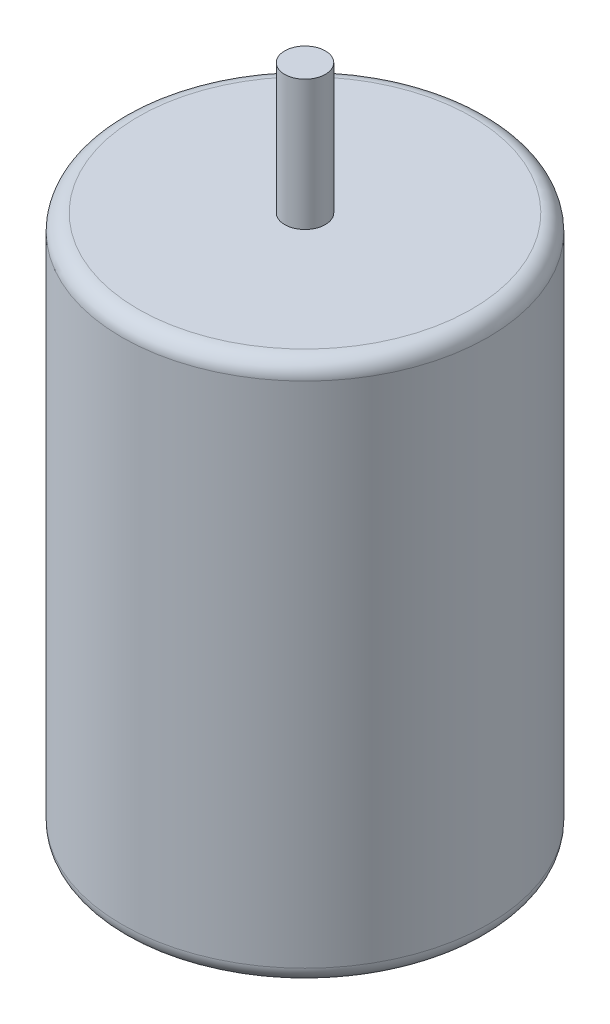
ISO-10303-21;
HEADER;
FILE_DESCRIPTION(('STEP AP214'),'2;1');
FILE_NAME('part.step','',(''),(''),'','','');
FILE_SCHEMA(('AUTOMOTIVE_DESIGN { 1 0 10303 214 1 1 1 1 }'));
ENDSEC;
DATA;
#1=APPLICATION_CONTEXT('core data for automotive mechanical design processes');
#2=APPLICATION_PROTOCOL_DEFINITION('international standard','automotive_design',2000,#1);
#3=PRODUCT_CONTEXT('',#1,'mechanical');
#4=PRODUCT('Part','Part','',(#3));
#5=PRODUCT_RELATED_PRODUCT_CATEGORY('part','',(#4));
#6=PRODUCT_DEFINITION_FORMATION('','',#4);
#7=PRODUCT_DEFINITION_CONTEXT('part definition',#1,'design');
#8=PRODUCT_DEFINITION('design','',#6,#7);
#9=PRODUCT_DEFINITION_SHAPE('','',#8);
#10=(LENGTH_UNIT() NAMED_UNIT(*) SI_UNIT(.MILLI.,.METRE.));
#11=(NAMED_UNIT(*) PLANE_ANGLE_UNIT() SI_UNIT($,.RADIAN.));
#12=(NAMED_UNIT(*) SI_UNIT($,.STERADIAN.) SOLID_ANGLE_UNIT());
#13=UNCERTAINTY_MEASURE_WITH_UNIT(LENGTH_MEASURE(1.E-05),#10,'distance_accuracy_value','');
#14=(GEOMETRIC_REPRESENTATION_CONTEXT(3) GLOBAL_UNCERTAINTY_ASSIGNED_CONTEXT((#13)) GLOBAL_UNIT_ASSIGNED_CONTEXT((#10,
#11,#12)) REPRESENTATION_CONTEXT('',''));
#15=CARTESIAN_POINT('',(0.,0.,0.));
#16=DIRECTION('',(0.,0.,1.));
#17=DIRECTION('',(1.,0.,0.));
#18=AXIS2_PLACEMENT_3D('',#15,#16,#17);
#19=CARTESIAN_POINT('',(0.,66.5,0.));
#20=DIRECTION('',(0.,-1.,0.));
#21=DIRECTION('',(0.,0.,-1.));
#22=AXIS2_PLACEMENT_3D('',#19,#20,#21);
#23=CYLINDRICAL_SURFACE('',#22,22.5);
#24=CARTESIAN_POINT('',(0.,2.,0.));
#25=DIRECTION('',(0.,1.,0.));
#26=DIRECTION('',(0.,0.,1.));
#27=AXIS2_PLACEMENT_3D('',#24,#25,#26);
#28=CIRCLE('',#27,22.5);
#29=CARTESIAN_POINT('',(0.,2.,22.5));
#30=VERTEX_POINT('',#29);
#31=EDGE_CURVE('E43',#30,#30,#28,.T.);
#32=ORIENTED_EDGE('',*,*,#31,.T.);
#33=EDGE_LOOP('',(#32));
#34=FACE_BOUND('',#33,.T.);
#35=CARTESIAN_POINT('',(0.,64.5,0.));
#36=DIRECTION('',(0.,1.,0.));
#37=DIRECTION('',(0.,0.,1.));
#38=AXIS2_PLACEMENT_3D('',#35,#36,#37);
#39=CIRCLE('',#38,22.5);
#40=CARTESIAN_POINT('',(0.,64.5,22.5));
#41=VERTEX_POINT('',#40);
#42=EDGE_CURVE('E47',#41,#41,#39,.F.);
#43=ORIENTED_EDGE('',*,*,#42,.T.);
#44=EDGE_LOOP('',(#43));
#45=FACE_BOUND('',#44,.T.);
#46=ADVANCED_FACE('F32',(#34,#45),#23,.T.);
#47=CARTESIAN_POINT('',(0.,66.5,0.));
#48=DIRECTION('',(0.,1.,0.));
#49=DIRECTION('',(0.,0.,1.));
#50=AXIS2_PLACEMENT_3D('',#47,#48,#49);
#51=PLANE('',#50);
#52=CARTESIAN_POINT('',(0.,66.5,0.));
#53=DIRECTION('',(0.,1.,0.));
#54=DIRECTION('',(0.,0.,1.));
#55=AXIS2_PLACEMENT_3D('',#52,#53,#54);
#56=CIRCLE('',#55,20.5);
#57=CARTESIAN_POINT('',(0.,66.5,20.5));
#58=VERTEX_POINT('',#57);
#59=EDGE_CURVE('E10',#58,#58,#56,.T.);
#60=ORIENTED_EDGE('',*,*,#59,.T.);
#61=EDGE_LOOP('',(#60));
#62=FACE_BOUND('',#61,.T.);
#63=CARTESIAN_POINT('',(0.,66.5,0.));
#64=DIRECTION('',(0.,1.,0.));
#65=DIRECTION('',(0.,0.,1.));
#66=AXIS2_PLACEMENT_3D('',#63,#64,#65);
#67=CIRCLE('',#66,2.5);
#68=CARTESIAN_POINT('',(0.,66.5,2.5));
#69=VERTEX_POINT('',#68);
#70=EDGE_CURVE('E53',#69,#69,#67,.T.);
#71=ORIENTED_EDGE('',*,*,#70,.F.);
#72=EDGE_LOOP('',(#71));
#73=FACE_BOUND('',#72,.T.);
#74=ADVANCED_FACE('F68',(#62,#73),#51,.T.);
#75=CARTESIAN_POINT('',(0.,0.,0.));
#76=DIRECTION('',(0.,1.,0.));
#77=DIRECTION('',(0.,0.,1.));
#78=AXIS2_PLACEMENT_3D('',#75,#76,#77);
#79=PLANE('',#78);
#80=CARTESIAN_POINT('',(0.,0.,0.));
#81=DIRECTION('',(0.,1.,0.));
#82=DIRECTION('',(0.,0.,1.));
#83=AXIS2_PLACEMENT_3D('',#80,#81,#82);
#84=CIRCLE('',#83,20.5);
#85=CARTESIAN_POINT('',(0.,0.,20.5));
#86=VERTEX_POINT('',#85);
#87=EDGE_CURVE('E39',#86,#86,#84,.F.);
#88=ORIENTED_EDGE('',*,*,#87,.T.);
#89=EDGE_LOOP('',(#88));
#90=FACE_BOUND('',#89,.T.);
#91=ADVANCED_FACE('F64',(#90),#79,.F.);
#92=CARTESIAN_POINT('',(0.,82.5,0.));
#93=DIRECTION('',(0.,-1.,0.));
#94=DIRECTION('',(0.,0.,-1.));
#95=AXIS2_PLACEMENT_3D('',#92,#93,#94);
#96=CYLINDRICAL_SURFACE('',#95,2.5);
#97=CARTESIAN_POINT('',(0.,82.5,0.));
#98=DIRECTION('',(0.,1.,0.));
#99=DIRECTION('',(0.,0.,1.));
#100=AXIS2_PLACEMENT_3D('',#97,#98,#99);
#101=CIRCLE('',#100,2.5);
#102=CARTESIAN_POINT('',(0.,82.5,2.5));
#103=VERTEX_POINT('',#102);
#104=EDGE_CURVE('E52',#103,#103,#101,.T.);
#105=ORIENTED_EDGE('',*,*,#104,.F.);
#106=EDGE_LOOP('',(#105));
#107=FACE_BOUND('',#106,.T.);
#108=ORIENTED_EDGE('',*,*,#70,.T.);
#109=EDGE_LOOP('',(#108));
#110=FACE_BOUND('',#109,.T.);
#111=ADVANCED_FACE('F61',(#107,#110),#96,.T.);
#112=CARTESIAN_POINT('',(0.,82.5,0.));
#113=DIRECTION('',(0.,1.,0.));
#114=DIRECTION('',(0.,0.,1.));
#115=AXIS2_PLACEMENT_3D('',#112,#113,#114);
#116=PLANE('',#115);
#117=ORIENTED_EDGE('',*,*,#104,.T.);
#118=EDGE_LOOP('',(#117));
#119=FACE_BOUND('',#118,.T.);
#120=ADVANCED_FACE('F59',(#119),#116,.T.);
#121=CARTESIAN_POINT('',(0.,2.,0.));
#122=DIRECTION('',(0.,1.,0.));
#123=DIRECTION('',(0.,0.,1.));
#124=AXIS2_PLACEMENT_3D('',#121,#122,#123);
#125=TOROIDAL_SURFACE('',#124,20.5,2.);
#126=ORIENTED_EDGE('',*,*,#87,.F.);
#127=EDGE_LOOP('',(#126));
#128=FACE_BOUND('',#127,.T.);
#129=ORIENTED_EDGE('',*,*,#31,.F.);
#130=EDGE_LOOP('',(#129));
#131=FACE_BOUND('',#130,.T.);
#132=ADVANCED_FACE('F79',(#128,#131),#125,.T.);
#133=CARTESIAN_POINT('',(0.,64.5,0.));
#134=DIRECTION('',(0.,1.,0.));
#135=DIRECTION('',(0.,0.,1.));
#136=AXIS2_PLACEMENT_3D('',#133,#134,#135);
#137=TOROIDAL_SURFACE('',#136,20.5,2.);
#138=ORIENTED_EDGE('',*,*,#42,.F.);
#139=EDGE_LOOP('',(#138));
#140=FACE_BOUND('',#139,.T.);
#141=ORIENTED_EDGE('',*,*,#59,.F.);
#142=EDGE_LOOP('',(#141));
#143=FACE_BOUND('',#142,.T.);
#144=ADVANCED_FACE('F34',(#140,#143),#137,.T.);
#145=CLOSED_SHELL('',(#46,#74,#91,#111,#120,#132,#144));
#146=MANIFOLD_SOLID_BREP('B2',#145);
#147=ADVANCED_BREP_SHAPE_REPRESENTATION('',(#18,#146),#14);
#148=SHAPE_DEFINITION_REPRESENTATION(#9,#147);
ENDSEC;
END-ISO-10303-21;
